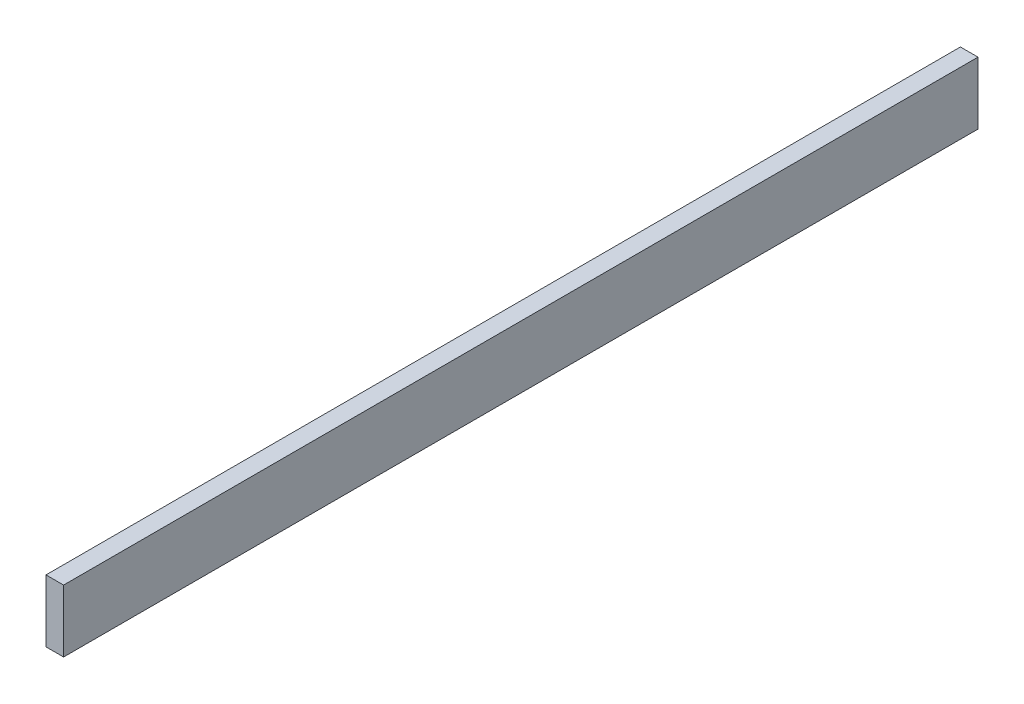
ISO-10303-21;
HEADER;
FILE_DESCRIPTION(('STEP AP214'),'2;1');
FILE_NAME('part.step','',(''),(''),'','','');
FILE_SCHEMA(('AUTOMOTIVE_DESIGN { 1 0 10303 214 1 1 1 1 }'));
ENDSEC;
DATA;
#1=APPLICATION_CONTEXT('core data for automotive mechanical design processes');
#2=APPLICATION_PROTOCOL_DEFINITION('international standard','automotive_design',2000,#1);
#3=PRODUCT_CONTEXT('',#1,'mechanical');
#4=PRODUCT('Part','Part','',(#3));
#5=PRODUCT_RELATED_PRODUCT_CATEGORY('part','',(#4));
#6=PRODUCT_DEFINITION_FORMATION('','',#4);
#7=PRODUCT_DEFINITION_CONTEXT('part definition',#1,'design');
#8=PRODUCT_DEFINITION('design','',#6,#7);
#9=PRODUCT_DEFINITION_SHAPE('','',#8);
#10=(LENGTH_UNIT() NAMED_UNIT(*) SI_UNIT(.MILLI.,.METRE.));
#11=(NAMED_UNIT(*) PLANE_ANGLE_UNIT() SI_UNIT($,.RADIAN.));
#12=(NAMED_UNIT(*) SI_UNIT($,.STERADIAN.) SOLID_ANGLE_UNIT());
#13=UNCERTAINTY_MEASURE_WITH_UNIT(LENGTH_MEASURE(1.E-05),#10,'distance_accuracy_value','');
#14=(GEOMETRIC_REPRESENTATION_CONTEXT(3) GLOBAL_UNCERTAINTY_ASSIGNED_CONTEXT((#13)) GLOBAL_UNIT_ASSIGNED_CONTEXT((#10,
#11,#12)) REPRESENTATION_CONTEXT('',''));
#15=CARTESIAN_POINT('',(0.,0.,0.));
#16=DIRECTION('',(0.,0.,1.));
#17=DIRECTION('',(1.,0.,0.));
#18=AXIS2_PLACEMENT_3D('',#15,#16,#17);
#19=CARTESIAN_POINT('',(605.3,14.,-660.));
#20=DIRECTION('',(-1.,0.,0.));
#21=DIRECTION('',(0.,0.,1.));
#22=AXIS2_PLACEMENT_3D('',#19,#20,#21);
#23=PLANE('',#22);
#24=DIRECTION('',(0.,-1.,0.));
#25=VECTOR('',#24,1.);
#26=CARTESIAN_POINT('',(605.3,14.,0.));
#27=LINE('',#26,#25);
#28=CARTESIAN_POINT('',(605.3,59.,0.));
#29=VERTEX_POINT('',#28);
#30=CARTESIAN_POINT('',(605.3,14.,0.));
#31=VERTEX_POINT('',#30);
#32=EDGE_CURVE('E103',#29,#31,#27,.T.);
#33=ORIENTED_EDGE('',*,*,#32,.F.);
#34=DIRECTION('',(0.,0.,1.));
#35=VECTOR('',#34,1.);
#36=CARTESIAN_POINT('',(605.3,59.,-660.));
#37=LINE('',#36,#35);
#38=CARTESIAN_POINT('',(605.3,59.,-660.));
#39=VERTEX_POINT('',#38);
#40=EDGE_CURVE('E11',#39,#29,#37,.T.);
#41=ORIENTED_EDGE('',*,*,#40,.F.);
#42=DIRECTION('',(0.,-1.,0.));
#43=VECTOR('',#42,1.);
#44=CARTESIAN_POINT('',(605.3,14.,-660.));
#45=LINE('',#44,#43);
#46=CARTESIAN_POINT('',(605.3,14.,-660.));
#47=VERTEX_POINT('',#46);
#48=EDGE_CURVE('E97',#39,#47,#45,.T.);
#49=ORIENTED_EDGE('',*,*,#48,.T.);
#50=DIRECTION('',(0.,0.,1.));
#51=VECTOR('',#50,1.);
#52=CARTESIAN_POINT('',(605.3,14.,-660.));
#53=LINE('',#52,#51);
#54=EDGE_CURVE('E42',#47,#31,#53,.T.);
#55=ORIENTED_EDGE('',*,*,#54,.T.);
#56=EDGE_LOOP('',(#33,#41,#49,#55));
#57=FACE_BOUND('',#56,.T.);
#58=ADVANCED_FACE('F39',(#57),#23,.T.);
#59=CARTESIAN_POINT('',(605.3,59.,-660.));
#60=DIRECTION('',(0.,1.,0.));
#61=DIRECTION('',(0.,0.,1.));
#62=AXIS2_PLACEMENT_3D('',#59,#60,#61);
#63=PLANE('',#62);
#64=DIRECTION('',(-1.,0.,0.));
#65=VECTOR('',#64,1.);
#66=CARTESIAN_POINT('',(605.3,59.,0.));
#67=LINE('',#66,#65);
#68=CARTESIAN_POINT('',(618.,59.,0.));
#69=VERTEX_POINT('',#68);
#70=EDGE_CURVE('E99',#69,#29,#67,.T.);
#71=ORIENTED_EDGE('',*,*,#70,.F.);
#72=DIRECTION('',(0.,0.,1.));
#73=VECTOR('',#72,1.);
#74=CARTESIAN_POINT('',(618.,59.,-660.));
#75=LINE('',#74,#73);
#76=CARTESIAN_POINT('',(618.,59.,-660.));
#77=VERTEX_POINT('',#76);
#78=EDGE_CURVE('E48',#77,#69,#75,.T.);
#79=ORIENTED_EDGE('',*,*,#78,.F.);
#80=DIRECTION('',(-1.,0.,0.));
#81=VECTOR('',#80,1.);
#82=CARTESIAN_POINT('',(605.3,59.,-660.));
#83=LINE('',#82,#81);
#84=EDGE_CURVE('E94',#77,#39,#83,.T.);
#85=ORIENTED_EDGE('',*,*,#84,.T.);
#86=ORIENTED_EDGE('',*,*,#40,.T.);
#87=EDGE_LOOP('',(#71,#79,#85,#86));
#88=FACE_BOUND('',#87,.T.);
#89=ADVANCED_FACE('F113',(#88),#63,.T.);
#90=CARTESIAN_POINT('',(618.,14.,-660.));
#91=DIRECTION('',(1.,0.,0.));
#92=DIRECTION('',(0.,0.,-1.));
#93=AXIS2_PLACEMENT_3D('',#90,#91,#92);
#94=PLANE('',#93);
#95=DIRECTION('',(0.,1.,0.));
#96=VECTOR('',#95,1.);
#97=CARTESIAN_POINT('',(618.,14.,0.));
#98=LINE('',#97,#96);
#99=CARTESIAN_POINT('',(618.,14.,0.));
#100=VERTEX_POINT('',#99);
#101=EDGE_CURVE('E89',#100,#69,#98,.T.);
#102=ORIENTED_EDGE('',*,*,#101,.F.);
#103=DIRECTION('',(0.,0.,1.));
#104=VECTOR('',#103,1.);
#105=CARTESIAN_POINT('',(618.,14.,-660.));
#106=LINE('',#105,#104);
#107=CARTESIAN_POINT('',(618.,14.,-660.));
#108=VERTEX_POINT('',#107);
#109=EDGE_CURVE('E84',#108,#100,#106,.T.);
#110=ORIENTED_EDGE('',*,*,#109,.F.);
#111=DIRECTION('',(0.,1.,0.));
#112=VECTOR('',#111,1.);
#113=CARTESIAN_POINT('',(618.,14.,-660.));
#114=LINE('',#113,#112);
#115=EDGE_CURVE('E87',#108,#77,#114,.T.);
#116=ORIENTED_EDGE('',*,*,#115,.T.);
#117=ORIENTED_EDGE('',*,*,#78,.T.);
#118=EDGE_LOOP('',(#102,#110,#116,#117));
#119=FACE_BOUND('',#118,.T.);
#120=ADVANCED_FACE('F86',(#119),#94,.T.);
#121=CARTESIAN_POINT('',(605.3,14.,-660.));
#122=DIRECTION('',(0.,-1.,0.));
#123=DIRECTION('',(0.,0.,-1.));
#124=AXIS2_PLACEMENT_3D('',#121,#122,#123);
#125=PLANE('',#124);
#126=DIRECTION('',(1.,0.,0.));
#127=VECTOR('',#126,1.);
#128=CARTESIAN_POINT('',(605.3,14.,0.));
#129=LINE('',#128,#127);
#130=EDGE_CURVE('E106',#31,#100,#129,.T.);
#131=ORIENTED_EDGE('',*,*,#130,.F.);
#132=ORIENTED_EDGE('',*,*,#54,.F.);
#133=DIRECTION('',(1.,0.,0.));
#134=VECTOR('',#133,1.);
#135=CARTESIAN_POINT('',(605.3,14.,-660.));
#136=LINE('',#135,#134);
#137=EDGE_CURVE('E93',#47,#108,#136,.T.);
#138=ORIENTED_EDGE('',*,*,#137,.T.);
#139=ORIENTED_EDGE('',*,*,#109,.T.);
#140=EDGE_LOOP('',(#131,#132,#138,#139));
#141=FACE_BOUND('',#140,.T.);
#142=ADVANCED_FACE('F96',(#141),#125,.T.);
#143=CARTESIAN_POINT('',(0.,0.,-660.));
#144=DIRECTION('',(0.,0.,-1.));
#145=DIRECTION('',(-1.,0.,0.));
#146=AXIS2_PLACEMENT_3D('',#143,#144,#145);
#147=PLANE('',#146);
#148=ORIENTED_EDGE('',*,*,#48,.F.);
#149=ORIENTED_EDGE('',*,*,#84,.F.);
#150=ORIENTED_EDGE('',*,*,#115,.F.);
#151=ORIENTED_EDGE('',*,*,#137,.F.);
#152=EDGE_LOOP('',(#148,#149,#150,#151));
#153=FACE_BOUND('',#152,.T.);
#154=ADVANCED_FACE('F92',(#153),#147,.T.);
#155=CARTESIAN_POINT('',(0.,0.,0.));
#156=DIRECTION('',(0.,0.,-1.));
#157=DIRECTION('',(-1.,0.,0.));
#158=AXIS2_PLACEMENT_3D('',#155,#156,#157);
#159=PLANE('',#158);
#160=ORIENTED_EDGE('',*,*,#32,.T.);
#161=ORIENTED_EDGE('',*,*,#130,.T.);
#162=ORIENTED_EDGE('',*,*,#101,.T.);
#163=ORIENTED_EDGE('',*,*,#70,.T.);
#164=EDGE_LOOP('',(#160,#161,#162,#163));
#165=FACE_BOUND('',#164,.T.);
#166=ADVANCED_FACE('F112',(#165),#159,.F.);
#167=CLOSED_SHELL('',(#58,#89,#120,#142,#154,#166));
#168=MANIFOLD_SOLID_BREP('B2',#167);
#169=ADVANCED_BREP_SHAPE_REPRESENTATION('',(#18,#168),#14);
#170=SHAPE_DEFINITION_REPRESENTATION(#9,#169);
ENDSEC;
END-ISO-10303-21;
